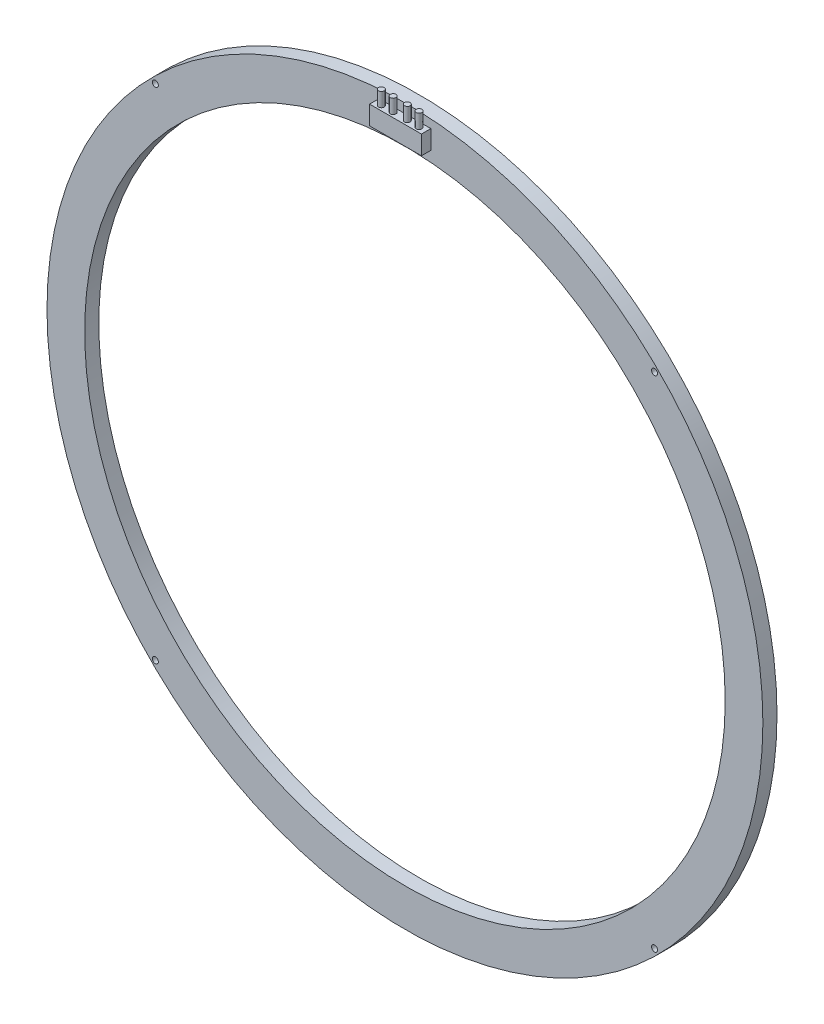
ISO-10303-21;
HEADER;
FILE_DESCRIPTION(('STEP AP214'),'2;1');
FILE_NAME('part.step','',(''),(''),'','','');
FILE_SCHEMA(('AUTOMOTIVE_DESIGN { 1 0 10303 214 1 1 1 1 }'));
ENDSEC;
DATA;
#1=APPLICATION_CONTEXT('core data for automotive mechanical design processes');
#2=APPLICATION_PROTOCOL_DEFINITION('international standard','automotive_design',2000,#1);
#3=PRODUCT_CONTEXT('',#1,'mechanical');
#4=PRODUCT('Part','Part','',(#3));
#5=PRODUCT_RELATED_PRODUCT_CATEGORY('part','',(#4));
#6=PRODUCT_DEFINITION_FORMATION('','',#4);
#7=PRODUCT_DEFINITION_CONTEXT('part definition',#1,'design');
#8=PRODUCT_DEFINITION('design','',#6,#7);
#9=PRODUCT_DEFINITION_SHAPE('','',#8);
#10=(LENGTH_UNIT() NAMED_UNIT(*) SI_UNIT(.MILLI.,.METRE.));
#11=(NAMED_UNIT(*) PLANE_ANGLE_UNIT() SI_UNIT($,.RADIAN.));
#12=(NAMED_UNIT(*) SI_UNIT($,.STERADIAN.) SOLID_ANGLE_UNIT());
#13=UNCERTAINTY_MEASURE_WITH_UNIT(LENGTH_MEASURE(1.E-05),#10,'distance_accuracy_value','');
#14=(GEOMETRIC_REPRESENTATION_CONTEXT(3) GLOBAL_UNCERTAINTY_ASSIGNED_CONTEXT((#13)) GLOBAL_UNIT_ASSIGNED_CONTEXT((#10,
#11,#12)) REPRESENTATION_CONTEXT('',''));
#15=CARTESIAN_POINT('',(0.,0.,0.));
#16=DIRECTION('',(0.,0.,1.));
#17=DIRECTION('',(1.,0.,0.));
#18=AXIS2_PLACEMENT_3D('',#15,#16,#17);
#19=CARTESIAN_POINT('',(0.,0.,3.));
#20=DIRECTION('',(0.,0.,1.));
#21=DIRECTION('',(1.,0.,0.));
#22=AXIS2_PLACEMENT_3D('',#19,#20,#21);
#23=PLANE('',#22);
#24=CARTESIAN_POINT('',(53.,-53.,3.));
#25=DIRECTION('',(0.,0.,1.));
#26=DIRECTION('',(1.,0.,0.));
#27=AXIS2_PLACEMENT_3D('',#24,#25,#26);
#28=CIRCLE('',#27,0.649999999999997);
#29=CARTESIAN_POINT('',(53.65,-53.,3.));
#30=VERTEX_POINT('',#29);
#31=EDGE_CURVE('E119',#30,#30,#28,.T.);
#32=ORIENTED_EDGE('',*,*,#31,.F.);
#33=EDGE_LOOP('',(#32));
#34=FACE_BOUND('',#33,.T.);
#35=CARTESIAN_POINT('',(-53.,53.,3.));
#36=DIRECTION('',(0.,0.,1.));
#37=DIRECTION('',(1.,0.,0.));
#38=AXIS2_PLACEMENT_3D('',#35,#36,#37);
#39=CIRCLE('',#38,0.649999999999997);
#40=CARTESIAN_POINT('',(-52.35,53.,3.));
#41=VERTEX_POINT('',#40);
#42=EDGE_CURVE('E131',#41,#41,#39,.T.);
#43=ORIENTED_EDGE('',*,*,#42,.F.);
#44=EDGE_LOOP('',(#43));
#45=FACE_BOUND('',#44,.T.);
#46=CARTESIAN_POINT('',(0.,0.,3.));
#47=DIRECTION('',(0.,0.,1.));
#48=DIRECTION('',(1.,0.,0.));
#49=AXIS2_PLACEMENT_3D('',#46,#47,#48);
#50=CIRCLE('',#49,76.);
#51=CARTESIAN_POINT('',(76.,0.,3.));
#52=VERTEX_POINT('',#51);
#53=EDGE_CURVE('E143',#52,#52,#50,.T.);
#54=ORIENTED_EDGE('',*,*,#53,.T.);
#55=EDGE_LOOP('',(#54));
#56=FACE_BOUND('',#55,.T.);
#57=CARTESIAN_POINT('',(0.,0.,3.));
#58=DIRECTION('',(0.,0.,1.));
#59=DIRECTION('',(1.,0.,0.));
#60=AXIS2_PLACEMENT_3D('',#57,#58,#59);
#61=CIRCLE('',#60,68.);
#62=CARTESIAN_POINT('',(68.,0.,3.));
#63=VERTEX_POINT('',#62);
#64=EDGE_CURVE('E137',#63,#63,#61,.T.);
#65=ORIENTED_EDGE('',*,*,#64,.F.);
#66=EDGE_LOOP('',(#65));
#67=FACE_BOUND('',#66,.T.);
#68=CARTESIAN_POINT('',(53.,53.,3.));
#69=DIRECTION('',(0.,0.,1.));
#70=DIRECTION('',(1.,0.,0.));
#71=AXIS2_PLACEMENT_3D('',#68,#69,#70);
#72=CIRCLE('',#71,0.649999999999997);
#73=CARTESIAN_POINT('',(53.65,53.,3.));
#74=VERTEX_POINT('',#73);
#75=EDGE_CURVE('E125',#74,#74,#72,.T.);
#76=ORIENTED_EDGE('',*,*,#75,.F.);
#77=EDGE_LOOP('',(#76));
#78=FACE_BOUND('',#77,.T.);
#79=CARTESIAN_POINT('',(-53.,-53.,3.));
#80=DIRECTION('',(0.,0.,1.));
#81=DIRECTION('',(1.,0.,0.));
#82=AXIS2_PLACEMENT_3D('',#79,#80,#81);
#83=CIRCLE('',#82,0.649999999999997);
#84=CARTESIAN_POINT('',(-52.35,-53.,3.));
#85=VERTEX_POINT('',#84);
#86=EDGE_CURVE('E113',#85,#85,#83,.T.);
#87=ORIENTED_EDGE('',*,*,#86,.F.);
#88=EDGE_LOOP('',(#87));
#89=FACE_BOUND('',#88,.T.);
#90=DIRECTION('',(1.,0.,0.));
#91=VECTOR('',#90,1.);
#92=CARTESIAN_POINT('',(5.5,70.,3.));
#93=LINE('',#92,#91);
#94=CARTESIAN_POINT('',(-5.5,70.,3.));
#95=VERTEX_POINT('',#94);
#96=CARTESIAN_POINT('',(5.5,70.,3.));
#97=VERTEX_POINT('',#96);
#98=EDGE_CURVE('E90',#95,#97,#93,.T.);
#99=ORIENTED_EDGE('',*,*,#98,.F.);
#100=DIRECTION('',(0.,-1.,0.));
#101=VECTOR('',#100,1.);
#102=CARTESIAN_POINT('',(-5.5,70.,3.));
#103=LINE('',#102,#101);
#104=CARTESIAN_POINT('',(-5.5,74.,3.));
#105=VERTEX_POINT('',#104);
#106=EDGE_CURVE('E101',#105,#95,#103,.T.);
#107=ORIENTED_EDGE('',*,*,#106,.F.);
#108=DIRECTION('',(-1.,0.,0.));
#109=VECTOR('',#108,1.);
#110=CARTESIAN_POINT('',(5.5,74.,3.));
#111=LINE('',#110,#109);
#112=CARTESIAN_POINT('',(5.5,74.,3.));
#113=VERTEX_POINT('',#112);
#114=EDGE_CURVE('E71',#113,#105,#111,.T.);
#115=ORIENTED_EDGE('',*,*,#114,.F.);
#116=DIRECTION('',(0.,1.,0.));
#117=VECTOR('',#116,1.);
#118=CARTESIAN_POINT('',(5.5,70.,3.));
#119=LINE('',#118,#117);
#120=EDGE_CURVE('E106',#97,#113,#119,.T.);
#121=ORIENTED_EDGE('',*,*,#120,.F.);
#122=EDGE_LOOP('',(#99,#107,#115,#121));
#123=FACE_BOUND('',#122,.T.);
#124=ADVANCED_FACE('F34',(#34,#45,#56,#67,#78,#89,#123),#23,.T.);
#125=CARTESIAN_POINT('',(0.,0.,0.));
#126=DIRECTION('',(0.,0.,1.));
#127=DIRECTION('',(1.,0.,0.));
#128=AXIS2_PLACEMENT_3D('',#125,#126,#127);
#129=PLANE('',#128);
#130=CARTESIAN_POINT('',(0.,0.,0.));
#131=DIRECTION('',(0.,0.,1.));
#132=DIRECTION('',(1.,0.,0.));
#133=AXIS2_PLACEMENT_3D('',#130,#131,#132);
#134=CIRCLE('',#133,76.);
#135=CARTESIAN_POINT('',(76.,0.,0.));
#136=VERTEX_POINT('',#135);
#137=EDGE_CURVE('E140',#136,#136,#134,.T.);
#138=ORIENTED_EDGE('',*,*,#137,.F.);
#139=EDGE_LOOP('',(#138));
#140=FACE_BOUND('',#139,.T.);
#141=CARTESIAN_POINT('',(0.,0.,0.));
#142=DIRECTION('',(0.,0.,1.));
#143=DIRECTION('',(1.,0.,0.));
#144=AXIS2_PLACEMENT_3D('',#141,#142,#143);
#145=CIRCLE('',#144,68.);
#146=CARTESIAN_POINT('',(68.,0.,0.));
#147=VERTEX_POINT('',#146);
#148=EDGE_CURVE('E134',#147,#147,#145,.T.);
#149=ORIENTED_EDGE('',*,*,#148,.T.);
#150=EDGE_LOOP('',(#149));
#151=FACE_BOUND('',#150,.T.);
#152=CARTESIAN_POINT('',(-53.,53.,0.));
#153=DIRECTION('',(0.,0.,1.));
#154=DIRECTION('',(1.,0.,0.));
#155=AXIS2_PLACEMENT_3D('',#152,#153,#154);
#156=CIRCLE('',#155,0.649999999999997);
#157=CARTESIAN_POINT('',(-52.35,53.,0.));
#158=VERTEX_POINT('',#157);
#159=EDGE_CURVE('E128',#158,#158,#156,.T.);
#160=ORIENTED_EDGE('',*,*,#159,.T.);
#161=EDGE_LOOP('',(#160));
#162=FACE_BOUND('',#161,.T.);
#163=CARTESIAN_POINT('',(53.,53.,0.));
#164=DIRECTION('',(0.,0.,1.));
#165=DIRECTION('',(1.,0.,0.));
#166=AXIS2_PLACEMENT_3D('',#163,#164,#165);
#167=CIRCLE('',#166,0.649999999999997);
#168=CARTESIAN_POINT('',(53.65,53.,0.));
#169=VERTEX_POINT('',#168);
#170=EDGE_CURVE('E122',#169,#169,#167,.T.);
#171=ORIENTED_EDGE('',*,*,#170,.T.);
#172=EDGE_LOOP('',(#171));
#173=FACE_BOUND('',#172,.T.);
#174=CARTESIAN_POINT('',(53.,-53.,0.));
#175=DIRECTION('',(0.,0.,1.));
#176=DIRECTION('',(1.,0.,0.));
#177=AXIS2_PLACEMENT_3D('',#174,#175,#176);
#178=CIRCLE('',#177,0.649999999999997);
#179=CARTESIAN_POINT('',(53.65,-53.,0.));
#180=VERTEX_POINT('',#179);
#181=EDGE_CURVE('E116',#180,#180,#178,.T.);
#182=ORIENTED_EDGE('',*,*,#181,.T.);
#183=EDGE_LOOP('',(#182));
#184=FACE_BOUND('',#183,.T.);
#185=CARTESIAN_POINT('',(-53.,-53.,0.));
#186=DIRECTION('',(0.,0.,1.));
#187=DIRECTION('',(1.,0.,0.));
#188=AXIS2_PLACEMENT_3D('',#185,#186,#187);
#189=CIRCLE('',#188,0.649999999999997);
#190=CARTESIAN_POINT('',(-52.35,-53.,0.));
#191=VERTEX_POINT('',#190);
#192=EDGE_CURVE('E112',#191,#191,#189,.T.);
#193=ORIENTED_EDGE('',*,*,#192,.T.);
#194=EDGE_LOOP('',(#193));
#195=FACE_BOUND('',#194,.T.);
#196=ADVANCED_FACE('F182',(#140,#151,#162,#173,#184,#195),#129,.F.);
#197=CARTESIAN_POINT('',(0.,0.,3.));
#198=DIRECTION('',(0.,0.,-1.));
#199=DIRECTION('',(-1.,0.,0.));
#200=AXIS2_PLACEMENT_3D('',#197,#198,#199);
#201=CYLINDRICAL_SURFACE('',#200,76.);
#202=ORIENTED_EDGE('',*,*,#53,.F.);
#203=EDGE_LOOP('',(#202));
#204=FACE_BOUND('',#203,.T.);
#205=ORIENTED_EDGE('',*,*,#137,.T.);
#206=EDGE_LOOP('',(#205));
#207=FACE_BOUND('',#206,.T.);
#208=ADVANCED_FACE('F36',(#204,#207),#201,.T.);
#209=CARTESIAN_POINT('',(0.,0.,3.));
#210=DIRECTION('',(0.,0.,-1.));
#211=DIRECTION('',(-1.,0.,0.));
#212=AXIS2_PLACEMENT_3D('',#209,#210,#211);
#213=CYLINDRICAL_SURFACE('',#212,68.);
#214=ORIENTED_EDGE('',*,*,#64,.T.);
#215=EDGE_LOOP('',(#214));
#216=FACE_BOUND('',#215,.T.);
#217=ORIENTED_EDGE('',*,*,#148,.F.);
#218=EDGE_LOOP('',(#217));
#219=FACE_BOUND('',#218,.T.);
#220=ADVANCED_FACE('F192',(#216,#219),#213,.F.);
#221=CARTESIAN_POINT('',(-53.,53.,3.));
#222=DIRECTION('',(0.,0.,-1.));
#223=DIRECTION('',(-1.,0.,0.));
#224=AXIS2_PLACEMENT_3D('',#221,#222,#223);
#225=CYLINDRICAL_SURFACE('',#224,0.649999999999997);
#226=ORIENTED_EDGE('',*,*,#42,.T.);
#227=EDGE_LOOP('',(#226));
#228=FACE_BOUND('',#227,.T.);
#229=ORIENTED_EDGE('',*,*,#159,.F.);
#230=EDGE_LOOP('',(#229));
#231=FACE_BOUND('',#230,.T.);
#232=ADVANCED_FACE('F195',(#228,#231),#225,.F.);
#233=CARTESIAN_POINT('',(53.,53.,3.));
#234=DIRECTION('',(0.,0.,-1.));
#235=DIRECTION('',(-1.,0.,0.));
#236=AXIS2_PLACEMENT_3D('',#233,#234,#235);
#237=CYLINDRICAL_SURFACE('',#236,0.649999999999997);
#238=ORIENTED_EDGE('',*,*,#75,.T.);
#239=EDGE_LOOP('',(#238));
#240=FACE_BOUND('',#239,.T.);
#241=ORIENTED_EDGE('',*,*,#170,.F.);
#242=EDGE_LOOP('',(#241));
#243=FACE_BOUND('',#242,.T.);
#244=ADVANCED_FACE('F199',(#240,#243),#237,.F.);
#245=CARTESIAN_POINT('',(53.,-53.,3.));
#246=DIRECTION('',(0.,0.,-1.));
#247=DIRECTION('',(-1.,0.,0.));
#248=AXIS2_PLACEMENT_3D('',#245,#246,#247);
#249=CYLINDRICAL_SURFACE('',#248,0.649999999999997);
#250=ORIENTED_EDGE('',*,*,#31,.T.);
#251=EDGE_LOOP('',(#250));
#252=FACE_BOUND('',#251,.T.);
#253=ORIENTED_EDGE('',*,*,#181,.F.);
#254=EDGE_LOOP('',(#253));
#255=FACE_BOUND('',#254,.T.);
#256=ADVANCED_FACE('F203',(#252,#255),#249,.F.);
#257=CARTESIAN_POINT('',(-53.,-53.,3.));
#258=DIRECTION('',(0.,0.,-1.));
#259=DIRECTION('',(-1.,0.,0.));
#260=AXIS2_PLACEMENT_3D('',#257,#258,#259);
#261=CYLINDRICAL_SURFACE('',#260,0.649999999999997);
#262=ORIENTED_EDGE('',*,*,#86,.T.);
#263=EDGE_LOOP('',(#262));
#264=FACE_BOUND('',#263,.T.);
#265=ORIENTED_EDGE('',*,*,#192,.F.);
#266=EDGE_LOOP('',(#265));
#267=FACE_BOUND('',#266,.T.);
#268=ADVANCED_FACE('F207',(#264,#267),#261,.F.);
#269=CARTESIAN_POINT('',(-5.5,70.,5.));
#270=DIRECTION('',(1.,0.,0.));
#271=DIRECTION('',(0.,0.,-1.));
#272=AXIS2_PLACEMENT_3D('',#269,#270,#271);
#273=PLANE('',#272);
#274=ORIENTED_EDGE('',*,*,#106,.T.);
#275=DIRECTION('',(0.,0.,-1.));
#276=VECTOR('',#275,1.);
#277=CARTESIAN_POINT('',(-5.5,70.,5.));
#278=LINE('',#277,#276);
#279=CARTESIAN_POINT('',(-5.5,70.,5.));
#280=VERTEX_POINT('',#279);
#281=EDGE_CURVE('E93',#280,#95,#278,.T.);
#282=ORIENTED_EDGE('',*,*,#281,.F.);
#283=DIRECTION('',(0.,-1.,0.));
#284=VECTOR('',#283,1.);
#285=CARTESIAN_POINT('',(-5.5,70.,5.));
#286=LINE('',#285,#284);
#287=CARTESIAN_POINT('',(-5.5,74.,5.));
#288=VERTEX_POINT('',#287);
#289=EDGE_CURVE('E83',#288,#280,#286,.T.);
#290=ORIENTED_EDGE('',*,*,#289,.F.);
#291=DIRECTION('',(0.,0.,-1.));
#292=VECTOR('',#291,1.);
#293=CARTESIAN_POINT('',(-5.5,74.,5.));
#294=LINE('',#293,#292);
#295=EDGE_CURVE('E97',#288,#105,#294,.T.);
#296=ORIENTED_EDGE('',*,*,#295,.T.);
#297=EDGE_LOOP('',(#274,#282,#290,#296));
#298=FACE_BOUND('',#297,.T.);
#299=ADVANCED_FACE('F211',(#298),#273,.F.);
#300=CARTESIAN_POINT('',(5.5,70.,5.));
#301=DIRECTION('',(0.,1.,0.));
#302=DIRECTION('',(0.,0.,1.));
#303=AXIS2_PLACEMENT_3D('',#300,#301,#302);
#304=PLANE('',#303);
#305=ORIENTED_EDGE('',*,*,#98,.T.);
#306=DIRECTION('',(0.,0.,-1.));
#307=VECTOR('',#306,1.);
#308=CARTESIAN_POINT('',(5.5,70.,5.));
#309=LINE('',#308,#307);
#310=CARTESIAN_POINT('',(5.5,70.,5.));
#311=VERTEX_POINT('',#310);
#312=EDGE_CURVE('E87',#311,#97,#309,.T.);
#313=ORIENTED_EDGE('',*,*,#312,.F.);
#314=DIRECTION('',(1.,0.,0.));
#315=VECTOR('',#314,1.);
#316=CARTESIAN_POINT('',(5.5,70.,5.));
#317=LINE('',#316,#315);
#318=EDGE_CURVE('E78',#280,#311,#317,.T.);
#319=ORIENTED_EDGE('',*,*,#318,.F.);
#320=ORIENTED_EDGE('',*,*,#281,.T.);
#321=EDGE_LOOP('',(#305,#313,#319,#320));
#322=FACE_BOUND('',#321,.T.);
#323=ADVANCED_FACE('F88',(#322),#304,.F.);
#324=CARTESIAN_POINT('',(5.5,70.,5.));
#325=DIRECTION('',(-1.,0.,0.));
#326=DIRECTION('',(0.,0.,1.));
#327=AXIS2_PLACEMENT_3D('',#324,#325,#326);
#328=PLANE('',#327);
#329=ORIENTED_EDGE('',*,*,#120,.T.);
#330=DIRECTION('',(0.,0.,-1.));
#331=VECTOR('',#330,1.);
#332=CARTESIAN_POINT('',(5.5,74.,5.));
#333=LINE('',#332,#331);
#334=CARTESIAN_POINT('',(5.5,74.,5.));
#335=VERTEX_POINT('',#334);
#336=EDGE_CURVE('E49',#335,#113,#333,.T.);
#337=ORIENTED_EDGE('',*,*,#336,.F.);
#338=DIRECTION('',(0.,1.,0.));
#339=VECTOR('',#338,1.);
#340=CARTESIAN_POINT('',(5.5,70.,5.));
#341=LINE('',#340,#339);
#342=EDGE_CURVE('E81',#311,#335,#341,.T.);
#343=ORIENTED_EDGE('',*,*,#342,.F.);
#344=ORIENTED_EDGE('',*,*,#312,.T.);
#345=EDGE_LOOP('',(#329,#337,#343,#344));
#346=FACE_BOUND('',#345,.T.);
#347=ADVANCED_FACE('F95',(#346),#328,.F.);
#348=CARTESIAN_POINT('',(5.5,74.,5.));
#349=DIRECTION('',(0.,-1.,0.));
#350=DIRECTION('',(0.,0.,-1.));
#351=AXIS2_PLACEMENT_3D('',#348,#349,#350);
#352=PLANE('',#351);
#353=CARTESIAN_POINT('',(4.,74.,4.));
#354=DIRECTION('',(0.,-1.,0.));
#355=DIRECTION('',(0.,0.,-1.));
#356=AXIS2_PLACEMENT_3D('',#353,#354,#355);
#357=CIRCLE('',#356,0.6);
#358=CARTESIAN_POINT('',(4.,74.,3.4));
#359=VERTEX_POINT('',#358);
#360=EDGE_CURVE('E11',#359,#359,#357,.F.);
#361=ORIENTED_EDGE('',*,*,#360,.F.);
#362=EDGE_LOOP('',(#361));
#363=FACE_BOUND('',#362,.T.);
#364=CARTESIAN_POINT('',(-4.,74.,4.));
#365=DIRECTION('',(0.,-1.,0.));
#366=DIRECTION('',(0.,0.,-1.));
#367=AXIS2_PLACEMENT_3D('',#364,#365,#366);
#368=CIRCLE('',#367,0.6);
#369=CARTESIAN_POINT('',(-4.,74.,3.4));
#370=VERTEX_POINT('',#369);
#371=EDGE_CURVE('E42',#370,#370,#368,.F.);
#372=ORIENTED_EDGE('',*,*,#371,.F.);
#373=EDGE_LOOP('',(#372));
#374=FACE_BOUND('',#373,.T.);
#375=CARTESIAN_POINT('',(1.5,74.,4.));
#376=DIRECTION('',(0.,-1.,0.));
#377=DIRECTION('',(0.,0.,-1.));
#378=AXIS2_PLACEMENT_3D('',#375,#376,#377);
#379=CIRCLE('',#378,0.6);
#380=CARTESIAN_POINT('',(1.5,74.,3.4));
#381=VERTEX_POINT('',#380);
#382=EDGE_CURVE('E151',#381,#381,#379,.F.);
#383=ORIENTED_EDGE('',*,*,#382,.F.);
#384=EDGE_LOOP('',(#383));
#385=FACE_BOUND('',#384,.T.);
#386=CARTESIAN_POINT('',(-1.5,74.,4.));
#387=DIRECTION('',(0.,-1.,0.));
#388=DIRECTION('',(0.,0.,-1.));
#389=AXIS2_PLACEMENT_3D('',#386,#387,#388);
#390=CIRCLE('',#389,0.6);
#391=CARTESIAN_POINT('',(-1.5,74.,3.4));
#392=VERTEX_POINT('',#391);
#393=EDGE_CURVE('E146',#392,#392,#390,.F.);
#394=ORIENTED_EDGE('',*,*,#393,.F.);
#395=EDGE_LOOP('',(#394));
#396=FACE_BOUND('',#395,.T.);
#397=ORIENTED_EDGE('',*,*,#114,.T.);
#398=ORIENTED_EDGE('',*,*,#295,.F.);
#399=DIRECTION('',(-1.,0.,0.));
#400=VECTOR('',#399,1.);
#401=CARTESIAN_POINT('',(5.5,74.,5.));
#402=LINE('',#401,#400);
#403=EDGE_CURVE('E57',#335,#288,#402,.T.);
#404=ORIENTED_EDGE('',*,*,#403,.F.);
#405=ORIENTED_EDGE('',*,*,#336,.T.);
#406=EDGE_LOOP('',(#397,#398,#404,#405));
#407=FACE_BOUND('',#406,.T.);
#408=ADVANCED_FACE('F158',(#363,#374,#385,#396,#407),#352,.F.);
#409=CARTESIAN_POINT('',(0.,0.,5.));
#410=DIRECTION('',(0.,0.,1.));
#411=DIRECTION('',(1.,0.,0.));
#412=AXIS2_PLACEMENT_3D('',#409,#410,#411);
#413=PLANE('',#412);
#414=ORIENTED_EDGE('',*,*,#289,.T.);
#415=ORIENTED_EDGE('',*,*,#318,.T.);
#416=ORIENTED_EDGE('',*,*,#342,.T.);
#417=ORIENTED_EDGE('',*,*,#403,.T.);
#418=EDGE_LOOP('',(#414,#415,#416,#417));
#419=FACE_BOUND('',#418,.T.);
#420=ADVANCED_FACE('F79',(#419),#413,.T.);
#421=CARTESIAN_POINT('',(-1.5,77.,4.));
#422=DIRECTION('',(0.,-1.,0.));
#423=DIRECTION('',(0.,0.,-1.));
#424=AXIS2_PLACEMENT_3D('',#421,#422,#423);
#425=CYLINDRICAL_SURFACE('',#424,0.6);
#426=CARTESIAN_POINT('',(-1.5,77.,4.));
#427=DIRECTION('',(0.,1.,0.));
#428=DIRECTION('',(0.,0.,1.));
#429=AXIS2_PLACEMENT_3D('',#426,#427,#428);
#430=CIRCLE('',#429,0.6);
#431=CARTESIAN_POINT('',(-1.5,77.,4.6));
#432=VERTEX_POINT('',#431);
#433=EDGE_CURVE('E104',#432,#432,#430,.T.);
#434=ORIENTED_EDGE('',*,*,#433,.F.);
#435=EDGE_LOOP('',(#434));
#436=FACE_BOUND('',#435,.T.);
#437=ORIENTED_EDGE('',*,*,#393,.T.);
#438=EDGE_LOOP('',(#437));
#439=FACE_BOUND('',#438,.T.);
#440=ADVANCED_FACE('F167',(#436,#439),#425,.T.);
#441=CARTESIAN_POINT('',(-1.5,77.,4.));
#442=DIRECTION('',(0.,1.,0.));
#443=DIRECTION('',(0.,0.,1.));
#444=AXIS2_PLACEMENT_3D('',#441,#442,#443);
#445=PLANE('',#444);
#446=ORIENTED_EDGE('',*,*,#433,.T.);
#447=EDGE_LOOP('',(#446));
#448=FACE_BOUND('',#447,.T.);
#449=ADVANCED_FACE('F169',(#448),#445,.T.);
#450=CARTESIAN_POINT('',(1.5,77.,4.));
#451=DIRECTION('',(0.,-1.,0.));
#452=DIRECTION('',(0.,0.,-1.));
#453=AXIS2_PLACEMENT_3D('',#450,#451,#452);
#454=CYLINDRICAL_SURFACE('',#453,0.6);
#455=CARTESIAN_POINT('',(1.5,77.,4.));
#456=DIRECTION('',(0.,1.,0.));
#457=DIRECTION('',(0.,0.,-1.));
#458=AXIS2_PLACEMENT_3D('',#455,#456,#457);
#459=CIRCLE('',#458,0.6);
#460=CARTESIAN_POINT('',(1.5,77.,3.4));
#461=VERTEX_POINT('',#460);
#462=EDGE_CURVE('E311',#461,#461,#459,.T.);
#463=ORIENTED_EDGE('',*,*,#462,.F.);
#464=EDGE_LOOP('',(#463));
#465=FACE_BOUND('',#464,.T.);
#466=ORIENTED_EDGE('',*,*,#382,.T.);
#467=EDGE_LOOP('',(#466));
#468=FACE_BOUND('',#467,.T.);
#469=ADVANCED_FACE('F176',(#465,#468),#454,.T.);
#470=CARTESIAN_POINT('',(1.5,77.,4.));
#471=DIRECTION('',(0.,-1.,0.));
#472=DIRECTION('',(0.,0.,-1.));
#473=AXIS2_PLACEMENT_3D('',#470,#471,#472);
#474=PLANE('',#473);
#475=ORIENTED_EDGE('',*,*,#462,.T.);
#476=EDGE_LOOP('',(#475));
#477=FACE_BOUND('',#476,.T.);
#478=ADVANCED_FACE('F252',(#477),#474,.F.);
#479=CARTESIAN_POINT('',(-4.,77.,4.));
#480=DIRECTION('',(0.,-1.,0.));
#481=DIRECTION('',(0.,0.,-1.));
#482=AXIS2_PLACEMENT_3D('',#479,#480,#481);
#483=CYLINDRICAL_SURFACE('',#482,0.6);
#484=CARTESIAN_POINT('',(-4.,77.,4.));
#485=DIRECTION('',(0.,1.,0.));
#486=DIRECTION('',(0.,0.,1.));
#487=AXIS2_PLACEMENT_3D('',#484,#485,#486);
#488=CIRCLE('',#487,0.6);
#489=CARTESIAN_POINT('',(-4.,77.,4.6));
#490=VERTEX_POINT('',#489);
#491=EDGE_CURVE('E308',#490,#490,#488,.T.);
#492=ORIENTED_EDGE('',*,*,#491,.F.);
#493=EDGE_LOOP('',(#492));
#494=FACE_BOUND('',#493,.T.);
#495=ORIENTED_EDGE('',*,*,#371,.T.);
#496=EDGE_LOOP('',(#495));
#497=FACE_BOUND('',#496,.T.);
#498=ADVANCED_FACE('F156',(#494,#497),#483,.T.);
#499=CARTESIAN_POINT('',(-4.,77.,4.));
#500=DIRECTION('',(0.,1.,0.));
#501=DIRECTION('',(0.,0.,1.));
#502=AXIS2_PLACEMENT_3D('',#499,#500,#501);
#503=PLANE('',#502);
#504=ORIENTED_EDGE('',*,*,#491,.T.);
#505=EDGE_LOOP('',(#504));
#506=FACE_BOUND('',#505,.T.);
#507=ADVANCED_FACE('F269',(#506),#503,.T.);
#508=CARTESIAN_POINT('',(4.,77.,4.));
#509=DIRECTION('',(0.,-1.,0.));
#510=DIRECTION('',(0.,0.,-1.));
#511=AXIS2_PLACEMENT_3D('',#508,#509,#510);
#512=CYLINDRICAL_SURFACE('',#511,0.6);
#513=CARTESIAN_POINT('',(4.,77.,4.));
#514=DIRECTION('',(0.,1.,0.));
#515=DIRECTION('',(0.,0.,-1.));
#516=AXIS2_PLACEMENT_3D('',#513,#514,#515);
#517=CIRCLE('',#516,0.6);
#518=CARTESIAN_POINT('',(4.,77.,3.4));
#519=VERTEX_POINT('',#518);
#520=EDGE_CURVE('E307',#519,#519,#517,.T.);
#521=ORIENTED_EDGE('',*,*,#520,.F.);
#522=EDGE_LOOP('',(#521));
#523=FACE_BOUND('',#522,.T.);
#524=ORIENTED_EDGE('',*,*,#360,.T.);
#525=EDGE_LOOP('',(#524));
#526=FACE_BOUND('',#525,.T.);
#527=ADVANCED_FACE('F278',(#523,#526),#512,.T.);
#528=CARTESIAN_POINT('',(4.,77.,4.));
#529=DIRECTION('',(0.,-1.,0.));
#530=DIRECTION('',(0.,0.,-1.));
#531=AXIS2_PLACEMENT_3D('',#528,#529,#530);
#532=PLANE('',#531);
#533=ORIENTED_EDGE('',*,*,#520,.T.);
#534=EDGE_LOOP('',(#533));
#535=FACE_BOUND('',#534,.T.);
#536=ADVANCED_FACE('F287',(#535),#532,.F.);
#537=CLOSED_SHELL('',(#124,#196,#208,#220,#232,#244,#256,#268,#299,#323,#347,#408,#420,#440,
#449,#469,#478,#498,#507,#527,#536));
#538=MANIFOLD_SOLID_BREP('B2',#537);
#539=ADVANCED_BREP_SHAPE_REPRESENTATION('',(#18,#538),#14);
#540=SHAPE_DEFINITION_REPRESENTATION(#9,#539);
ENDSEC;
END-ISO-10303-21;
